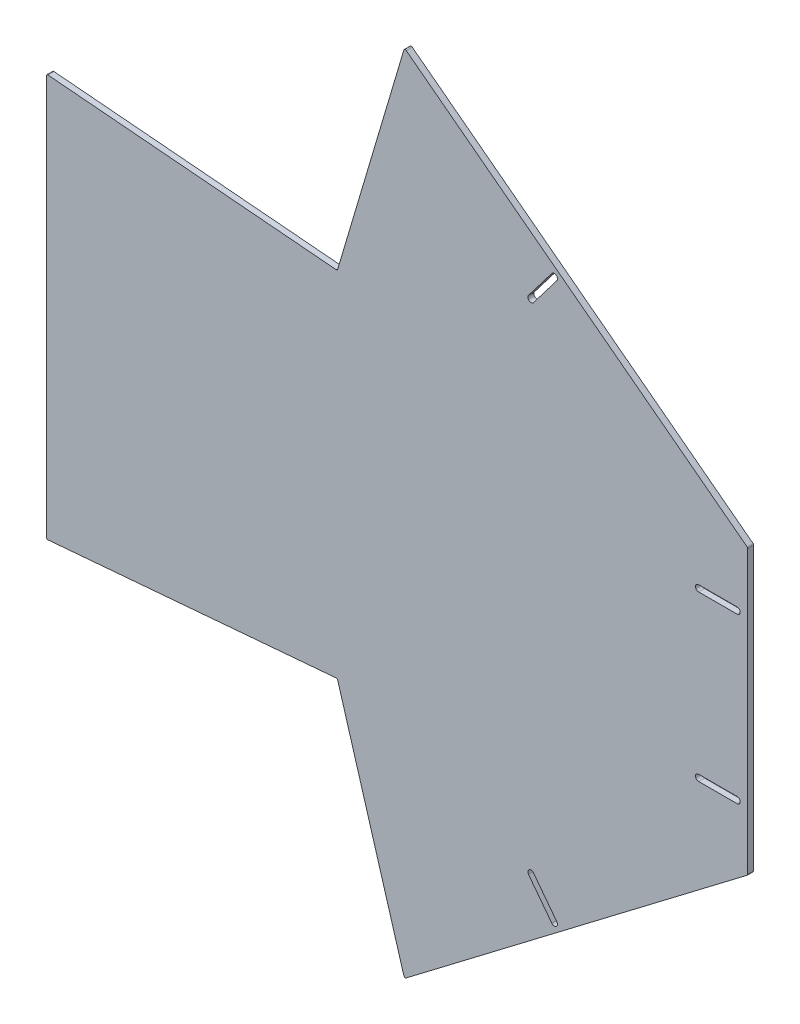
ISO-10303-21;
HEADER;
FILE_DESCRIPTION(('STEP AP214'),'2;1');
FILE_NAME('part.step','',(''),(''),'','','');
FILE_SCHEMA(('AUTOMOTIVE_DESIGN { 1 0 10303 214 1 1 1 1 }'));
ENDSEC;
DATA;
#1=APPLICATION_CONTEXT('core data for automotive mechanical design processes');
#2=APPLICATION_PROTOCOL_DEFINITION('international standard','automotive_design',2000,#1);
#3=PRODUCT_CONTEXT('',#1,'mechanical');
#4=PRODUCT('Part','Part','',(#3));
#5=PRODUCT_RELATED_PRODUCT_CATEGORY('part','',(#4));
#6=PRODUCT_DEFINITION_FORMATION('','',#4);
#7=PRODUCT_DEFINITION_CONTEXT('part definition',#1,'design');
#8=PRODUCT_DEFINITION('design','',#6,#7);
#9=PRODUCT_DEFINITION_SHAPE('','',#8);
#10=(LENGTH_UNIT() NAMED_UNIT(*) SI_UNIT(.MILLI.,.METRE.));
#11=(NAMED_UNIT(*) PLANE_ANGLE_UNIT() SI_UNIT($,.RADIAN.));
#12=(NAMED_UNIT(*) SI_UNIT($,.STERADIAN.) SOLID_ANGLE_UNIT());
#13=UNCERTAINTY_MEASURE_WITH_UNIT(LENGTH_MEASURE(1.E-05),#10,'distance_accuracy_value','');
#14=(GEOMETRIC_REPRESENTATION_CONTEXT(3) GLOBAL_UNCERTAINTY_ASSIGNED_CONTEXT((#13)) GLOBAL_UNIT_ASSIGNED_CONTEXT((#10,
#11,#12)) REPRESENTATION_CONTEXT('',''));
#15=CARTESIAN_POINT('',(0.,0.,0.));
#16=DIRECTION('',(0.,0.,1.));
#17=DIRECTION('',(1.,0.,0.));
#18=AXIS2_PLACEMENT_3D('',#15,#16,#17);
#19=CARTESIAN_POINT('',(-216.430442855931,164.6753369556,4.));
#20=DIRECTION('',(0.795828694120858,-0.605521832483264,0.));
#21=DIRECTION('',(0.605521832483264,0.795828694120858,0.));
#22=AXIS2_PLACEMENT_3D('',#19,#20,#21);
#23=PLANE('',#22);
#24=DIRECTION('',(-0.605521832483264,-0.795828694120858,0.));
#25=VECTOR('',#24,1.);
#26=CARTESIAN_POINT('',(-216.430442855931,164.6753369556,0.));
#27=LINE('',#26,#25);
#28=CARTESIAN_POINT('',(-127.898638669051,281.031422458357,0.));
#29=VERTEX_POINT('',#28);
#30=CARTESIAN_POINT('',(-143.521101947119,260.499042150039,0.));
#31=VERTEX_POINT('',#30);
#32=EDGE_CURVE('E472',#29,#31,#27,.T.);
#33=ORIENTED_EDGE('',*,*,#32,.T.);
#34=DIRECTION('',(0.,0.,-1.));
#35=VECTOR('',#34,1.);
#36=CARTESIAN_POINT('',(-143.521101947119,260.499042150039,4.));
#37=LINE('',#36,#35);
#38=CARTESIAN_POINT('',(-143.521101947119,260.499042150039,4.));
#39=VERTEX_POINT('',#38);
#40=EDGE_CURVE('E490',#39,#31,#37,.T.);
#41=ORIENTED_EDGE('',*,*,#40,.F.);
#42=DIRECTION('',(-0.605521832483264,-0.795828694120858,0.));
#43=VECTOR('',#42,1.);
#44=CARTESIAN_POINT('',(-216.430442855931,164.6753369556,4.));
#45=LINE('',#44,#43);
#46=CARTESIAN_POINT('',(-127.898638669051,281.031422458357,4.));
#47=VERTEX_POINT('',#46);
#48=EDGE_CURVE('E401',#47,#39,#45,.T.);
#49=ORIENTED_EDGE('',*,*,#48,.F.);
#50=DIRECTION('',(0.,0.,-1.));
#51=VECTOR('',#50,1.);
#52=CARTESIAN_POINT('',(-127.898638669051,281.031422458357,4.));
#53=LINE('',#52,#51);
#54=EDGE_CURVE('E482',#47,#29,#53,.T.);
#55=ORIENTED_EDGE('',*,*,#54,.T.);
#56=EDGE_LOOP('',(#33,#41,#49,#55));
#57=FACE_BOUND('',#56,.T.);
#58=ADVANCED_FACE('F46',(#57),#23,.F.);
#59=CARTESIAN_POINT('',(-145.192342204773,261.770637998254,4.));
#60=DIRECTION('',(0.,0.,-1.));
#61=DIRECTION('',(-1.,0.,0.));
#62=AXIS2_PLACEMENT_3D('',#59,#60,#61);
#63=CYLINDRICAL_SURFACE('',#62,2.10000000000001);
#64=CARTESIAN_POINT('',(-145.192342204773,261.770637998254,0.));
#65=DIRECTION('',(0.,0.,1.));
#66=DIRECTION('',(1.,0.,0.));
#67=AXIS2_PLACEMENT_3D('',#64,#65,#66);
#68=CIRCLE('',#67,2.10000000000001);
#69=CARTESIAN_POINT('',(-146.863582462426,263.042233846468,0.));
#70=VERTEX_POINT('',#69);
#71=EDGE_CURVE('E475',#31,#70,#68,.F.);
#72=ORIENTED_EDGE('',*,*,#71,.T.);
#73=DIRECTION('',(0.,0.,-1.));
#74=VECTOR('',#73,1.);
#75=CARTESIAN_POINT('',(-146.863582462426,263.042233846468,4.));
#76=LINE('',#75,#74);
#77=CARTESIAN_POINT('',(-146.863582462426,263.042233846468,4.));
#78=VERTEX_POINT('',#77);
#79=EDGE_CURVE('E488',#78,#70,#76,.T.);
#80=ORIENTED_EDGE('',*,*,#79,.F.);
#81=CARTESIAN_POINT('',(-145.192342204773,261.770637998254,4.));
#82=DIRECTION('',(0.,0.,1.));
#83=DIRECTION('',(1.,0.,0.));
#84=AXIS2_PLACEMENT_3D('',#81,#82,#83);
#85=CIRCLE('',#84,2.10000000000001);
#86=EDGE_CURVE('E406',#39,#78,#85,.F.);
#87=ORIENTED_EDGE('',*,*,#86,.F.);
#88=ORIENTED_EDGE('',*,*,#40,.T.);
#89=EDGE_LOOP('',(#72,#80,#87,#88));
#90=FACE_BOUND('',#89,.T.);
#91=ADVANCED_FACE('F640',(#90),#63,.F.);
#92=CARTESIAN_POINT('',(-219.772923371239,167.21852865203,4.));
#93=DIRECTION('',(0.795828694120859,-0.605521832483263,0.));
#94=DIRECTION('',(0.605521832483263,0.795828694120859,0.));
#95=AXIS2_PLACEMENT_3D('',#92,#93,#94);
#96=PLANE('',#95);
#97=DIRECTION('',(-0.605521832483263,-0.795828694120859,0.));
#98=VECTOR('',#97,1.);
#99=CARTESIAN_POINT('',(-219.772923371239,167.21852865203,0.));
#100=LINE('',#99,#98);
#101=CARTESIAN_POINT('',(-131.241119184358,283.574614154786,0.));
#102=VERTEX_POINT('',#101);
#103=EDGE_CURVE('E478',#102,#70,#100,.T.);
#104=ORIENTED_EDGE('',*,*,#103,.F.);
#105=DIRECTION('',(0.,0.,-1.));
#106=VECTOR('',#105,1.);
#107=CARTESIAN_POINT('',(-131.241119184358,283.574614154786,4.));
#108=LINE('',#107,#106);
#109=CARTESIAN_POINT('',(-131.241119184358,283.574614154786,4.));
#110=VERTEX_POINT('',#109);
#111=EDGE_CURVE('E485',#110,#102,#108,.T.);
#112=ORIENTED_EDGE('',*,*,#111,.F.);
#113=DIRECTION('',(-0.605521832483263,-0.795828694120859,0.));
#114=VECTOR('',#113,1.);
#115=CARTESIAN_POINT('',(-219.772923371239,167.21852865203,4.));
#116=LINE('',#115,#114);
#117=EDGE_CURVE('E408',#110,#78,#116,.T.);
#118=ORIENTED_EDGE('',*,*,#117,.T.);
#119=ORIENTED_EDGE('',*,*,#79,.T.);
#120=EDGE_LOOP('',(#104,#112,#118,#119));
#121=FACE_BOUND('',#120,.T.);
#122=ADVANCED_FACE('F646',(#121),#96,.T.);
#123=CARTESIAN_POINT('',(0.,152.1,4.));
#124=DIRECTION('',(0.,1.,0.));
#125=DIRECTION('',(0.,0.,1.));
#126=AXIS2_PLACEMENT_3D('',#123,#124,#125);
#127=PLANE('',#126);
#128=DIRECTION('',(1.,0.,0.));
#129=VECTOR('',#128,1.);
#130=CARTESIAN_POINT('',(0.,152.1,0.));
#131=LINE('',#130,#129);
#132=CARTESIAN_POINT('',(-32.9,152.1,0.));
#133=VERTEX_POINT('',#132);
#134=CARTESIAN_POINT('',(-7.09999999999999,152.1,0.));
#135=VERTEX_POINT('',#134);
#136=EDGE_CURVE('E461',#133,#135,#131,.T.);
#137=ORIENTED_EDGE('',*,*,#136,.T.);
#138=DIRECTION('',(0.,0.,-1.));
#139=VECTOR('',#138,1.);
#140=CARTESIAN_POINT('',(-7.09999999999999,152.1,4.));
#141=LINE('',#140,#139);
#142=CARTESIAN_POINT('',(-7.09999999999999,152.1,4.));
#143=VERTEX_POINT('',#142);
#144=EDGE_CURVE('E486',#143,#135,#141,.T.);
#145=ORIENTED_EDGE('',*,*,#144,.F.);
#146=DIRECTION('',(1.,0.,0.));
#147=VECTOR('',#146,1.);
#148=CARTESIAN_POINT('',(0.,152.1,4.));
#149=LINE('',#148,#147);
#150=CARTESIAN_POINT('',(-32.9,152.1,4.));
#151=VERTEX_POINT('',#150);
#152=EDGE_CURVE('E385',#151,#143,#149,.T.);
#153=ORIENTED_EDGE('',*,*,#152,.F.);
#154=DIRECTION('',(0.,0.,-1.));
#155=VECTOR('',#154,1.);
#156=CARTESIAN_POINT('',(-32.9,152.1,4.));
#157=LINE('',#156,#155);
#158=EDGE_CURVE('E494',#151,#133,#157,.T.);
#159=ORIENTED_EDGE('',*,*,#158,.T.);
#160=EDGE_LOOP('',(#137,#145,#153,#159));
#161=FACE_BOUND('',#160,.T.);
#162=ADVANCED_FACE('F665',(#161),#127,.F.);
#163=CARTESIAN_POINT('',(-7.09999999999999,150.,4.));
#164=DIRECTION('',(0.,0.,-1.));
#165=DIRECTION('',(-1.,0.,0.));
#166=AXIS2_PLACEMENT_3D('',#163,#164,#165);
#167=CYLINDRICAL_SURFACE('',#166,2.1);
#168=CARTESIAN_POINT('',(-7.09999999999999,150.,0.));
#169=DIRECTION('',(0.,0.,1.));
#170=DIRECTION('',(1.,0.,0.));
#171=AXIS2_PLACEMENT_3D('',#168,#169,#170);
#172=CIRCLE('',#171,2.1);
#173=CARTESIAN_POINT('',(-7.09999999999999,147.9,0.));
#174=VERTEX_POINT('',#173);
#175=EDGE_CURVE('E464',#135,#174,#172,.F.);
#176=ORIENTED_EDGE('',*,*,#175,.T.);
#177=DIRECTION('',(0.,0.,-1.));
#178=VECTOR('',#177,1.);
#179=CARTESIAN_POINT('',(-7.09999999999999,147.9,4.));
#180=LINE('',#179,#178);
#181=CARTESIAN_POINT('',(-7.09999999999999,147.9,4.));
#182=VERTEX_POINT('',#181);
#183=EDGE_CURVE('E500',#182,#174,#180,.T.);
#184=ORIENTED_EDGE('',*,*,#183,.F.);
#185=CARTESIAN_POINT('',(-7.09999999999999,150.,4.));
#186=DIRECTION('',(0.,0.,1.));
#187=DIRECTION('',(1.,0.,0.));
#188=AXIS2_PLACEMENT_3D('',#185,#186,#187);
#189=CIRCLE('',#188,2.1);
#190=EDGE_CURVE('E390',#143,#182,#189,.F.);
#191=ORIENTED_EDGE('',*,*,#190,.F.);
#192=ORIENTED_EDGE('',*,*,#144,.T.);
#193=EDGE_LOOP('',(#176,#184,#191,#192));
#194=FACE_BOUND('',#193,.T.);
#195=ADVANCED_FACE('F661',(#194),#167,.F.);
#196=CARTESIAN_POINT('',(0.,147.9,4.));
#197=DIRECTION('',(0.,1.,0.));
#198=DIRECTION('',(0.,0.,1.));
#199=AXIS2_PLACEMENT_3D('',#196,#197,#198);
#200=PLANE('',#199);
#201=DIRECTION('',(1.,0.,0.));
#202=VECTOR('',#201,1.);
#203=CARTESIAN_POINT('',(0.,147.9,0.));
#204=LINE('',#203,#202);
#205=CARTESIAN_POINT('',(-32.9,147.9,0.));
#206=VERTEX_POINT('',#205);
#207=EDGE_CURVE('E467',#206,#174,#204,.T.);
#208=ORIENTED_EDGE('',*,*,#207,.F.);
#209=DIRECTION('',(0.,0.,-1.));
#210=VECTOR('',#209,1.);
#211=CARTESIAN_POINT('',(-32.9,147.9,4.));
#212=LINE('',#211,#210);
#213=CARTESIAN_POINT('',(-32.9,147.9,4.));
#214=VERTEX_POINT('',#213);
#215=EDGE_CURVE('E497',#214,#206,#212,.T.);
#216=ORIENTED_EDGE('',*,*,#215,.F.);
#217=DIRECTION('',(1.,0.,0.));
#218=VECTOR('',#217,1.);
#219=CARTESIAN_POINT('',(0.,147.9,4.));
#220=LINE('',#219,#218);
#221=EDGE_CURVE('E394',#214,#182,#220,.T.);
#222=ORIENTED_EDGE('',*,*,#221,.T.);
#223=ORIENTED_EDGE('',*,*,#183,.T.);
#224=EDGE_LOOP('',(#208,#216,#222,#223));
#225=FACE_BOUND('',#224,.T.);
#226=ADVANCED_FACE('F657',(#225),#200,.T.);
#227=CARTESIAN_POINT('',(-7.1,40.,4.));
#228=DIRECTION('',(0.,0.,-1.));
#229=DIRECTION('',(-1.,0.,0.));
#230=AXIS2_PLACEMENT_3D('',#227,#228,#229);
#231=CYLINDRICAL_SURFACE('',#230,2.1);
#232=CARTESIAN_POINT('',(-7.1,40.,0.));
#233=DIRECTION('',(0.,0.,1.));
#234=DIRECTION('',(1.,0.,0.));
#235=AXIS2_PLACEMENT_3D('',#232,#233,#234);
#236=CIRCLE('',#235,2.1);
#237=CARTESIAN_POINT('',(-7.1,37.9,0.));
#238=VERTEX_POINT('',#237);
#239=CARTESIAN_POINT('',(-7.1,42.1,0.));
#240=VERTEX_POINT('',#239);
#241=EDGE_CURVE('E449',#238,#240,#236,.T.);
#242=ORIENTED_EDGE('',*,*,#241,.F.);
#243=DIRECTION('',(0.,0.,-1.));
#244=VECTOR('',#243,1.);
#245=CARTESIAN_POINT('',(-7.1,37.9,4.));
#246=LINE('',#245,#244);
#247=CARTESIAN_POINT('',(-7.1,37.9,4.));
#248=VERTEX_POINT('',#247);
#249=EDGE_CURVE('E498',#248,#238,#246,.T.);
#250=ORIENTED_EDGE('',*,*,#249,.F.);
#251=CARTESIAN_POINT('',(-7.1,40.,4.));
#252=DIRECTION('',(0.,0.,1.));
#253=DIRECTION('',(1.,0.,0.));
#254=AXIS2_PLACEMENT_3D('',#251,#252,#253);
#255=CIRCLE('',#254,2.1);
#256=CARTESIAN_POINT('',(-7.1,42.1,4.));
#257=VERTEX_POINT('',#256);
#258=EDGE_CURVE('E364',#248,#257,#255,.T.);
#259=ORIENTED_EDGE('',*,*,#258,.T.);
#260=DIRECTION('',(0.,0.,-1.));
#261=VECTOR('',#260,1.);
#262=CARTESIAN_POINT('',(-7.1,42.1,4.));
#263=LINE('',#262,#261);
#264=EDGE_CURVE('E266',#257,#240,#263,.T.);
#265=ORIENTED_EDGE('',*,*,#264,.T.);
#266=EDGE_LOOP('',(#242,#250,#259,#265));
#267=FACE_BOUND('',#266,.T.);
#268=ADVANCED_FACE('F660',(#267),#231,.F.);
#269=CARTESIAN_POINT('',(0.,37.9,4.));
#270=DIRECTION('',(0.,1.,0.));
#271=DIRECTION('',(0.,0.,1.));
#272=AXIS2_PLACEMENT_3D('',#269,#270,#271);
#273=PLANE('',#272);
#274=DIRECTION('',(1.,0.,0.));
#275=VECTOR('',#274,1.);
#276=CARTESIAN_POINT('',(0.,37.9,0.));
#277=LINE('',#276,#275);
#278=CARTESIAN_POINT('',(-32.9,37.9,0.));
#279=VERTEX_POINT('',#278);
#280=EDGE_CURVE('E452',#279,#238,#277,.T.);
#281=ORIENTED_EDGE('',*,*,#280,.F.);
#282=DIRECTION('',(0.,0.,-1.));
#283=VECTOR('',#282,1.);
#284=CARTESIAN_POINT('',(-32.9,37.9,4.));
#285=LINE('',#284,#283);
#286=CARTESIAN_POINT('',(-32.9,37.9,4.));
#287=VERTEX_POINT('',#286);
#288=EDGE_CURVE('E507',#287,#279,#285,.T.);
#289=ORIENTED_EDGE('',*,*,#288,.F.);
#290=DIRECTION('',(1.,0.,0.));
#291=VECTOR('',#290,1.);
#292=CARTESIAN_POINT('',(0.,37.9,4.));
#293=LINE('',#292,#291);
#294=EDGE_CURVE('E369',#287,#248,#293,.T.);
#295=ORIENTED_EDGE('',*,*,#294,.T.);
#296=ORIENTED_EDGE('',*,*,#249,.T.);
#297=EDGE_LOOP('',(#281,#289,#295,#296));
#298=FACE_BOUND('',#297,.T.);
#299=ADVANCED_FACE('F678',(#298),#273,.T.);
#300=CARTESIAN_POINT('',(-32.9,40.,4.));
#301=DIRECTION('',(0.,0.,-1.));
#302=DIRECTION('',(-1.,0.,0.));
#303=AXIS2_PLACEMENT_3D('',#300,#301,#302);
#304=CYLINDRICAL_SURFACE('',#303,2.1);
#305=CARTESIAN_POINT('',(-32.9,40.,0.));
#306=DIRECTION('',(0.,0.,1.));
#307=DIRECTION('',(1.,0.,0.));
#308=AXIS2_PLACEMENT_3D('',#305,#306,#307);
#309=CIRCLE('',#308,2.1);
#310=CARTESIAN_POINT('',(-32.9,42.1,0.));
#311=VERTEX_POINT('',#310);
#312=EDGE_CURVE('E455',#311,#279,#309,.T.);
#313=ORIENTED_EDGE('',*,*,#312,.F.);
#314=DIRECTION('',(0.,0.,-1.));
#315=VECTOR('',#314,1.);
#316=CARTESIAN_POINT('',(-32.9,42.1,4.));
#317=LINE('',#316,#315);
#318=CARTESIAN_POINT('',(-32.9,42.1,4.));
#319=VERTEX_POINT('',#318);
#320=EDGE_CURVE('E505',#319,#311,#317,.T.);
#321=ORIENTED_EDGE('',*,*,#320,.F.);
#322=CARTESIAN_POINT('',(-32.9,40.,4.));
#323=DIRECTION('',(0.,0.,1.));
#324=DIRECTION('',(1.,0.,0.));
#325=AXIS2_PLACEMENT_3D('',#322,#323,#324);
#326=CIRCLE('',#325,2.1);
#327=EDGE_CURVE('E377',#319,#287,#326,.T.);
#328=ORIENTED_EDGE('',*,*,#327,.T.);
#329=ORIENTED_EDGE('',*,*,#288,.T.);
#330=EDGE_LOOP('',(#313,#321,#328,#329));
#331=FACE_BOUND('',#330,.T.);
#332=ADVANCED_FACE('F674',(#331),#304,.F.);
#333=CARTESIAN_POINT('',(-259.115357669466,-76.9163482766205,4.));
#334=DIRECTION('',(-0.958655469434118,-0.284569307768865,0.));
#335=DIRECTION('',(0.284569307768865,-0.958655469434118,0.));
#336=AXIS2_PLACEMENT_3D('',#333,#334,#335);
#337=PLANE('',#336);
#338=DIRECTION('',(-0.284569307768865,0.958655469434118,0.));
#339=VECTOR('',#338,1.);
#340=CARTESIAN_POINT('',(-259.115357669466,-76.9163482766205,4.));
#341=LINE('',#340,#339);
#342=CARTESIAN_POINT('',(-230.411993405445,-173.612078953289,4.));
#343=VERTEX_POINT('',#342);
#344=CARTESIAN_POINT('',(-274.768194434869,-24.1851605917524,4.));
#345=VERTEX_POINT('',#344);
#346=EDGE_CURVE('E301',#343,#345,#341,.T.);
#347=ORIENTED_EDGE('',*,*,#346,.T.);
#348=DIRECTION('',(0.,0.,-1.));
#349=VECTOR('',#348,1.);
#350=CARTESIAN_POINT('',(-274.768194434869,-24.1851605917524,4.));
#351=LINE('',#350,#349);
#352=CARTESIAN_POINT('',(-274.768194434869,-24.1851605917524,0.));
#353=VERTEX_POINT('',#352);
#354=EDGE_CURVE('E515',#345,#353,#351,.T.);
#355=ORIENTED_EDGE('',*,*,#354,.T.);
#356=DIRECTION('',(-0.284569307768865,0.958655469434118,0.));
#357=VECTOR('',#356,1.);
#358=CARTESIAN_POINT('',(-259.115357669466,-76.9163482766205,0.));
#359=LINE('',#358,#357);
#360=CARTESIAN_POINT('',(-230.411993405445,-173.612078953289,0.));
#361=VERTEX_POINT('',#360);
#362=EDGE_CURVE('E426',#361,#353,#359,.T.);
#363=ORIENTED_EDGE('',*,*,#362,.F.);
#364=DIRECTION('',(0.,0.,-1.));
#365=VECTOR('',#364,1.);
#366=CARTESIAN_POINT('',(-230.411993405445,-173.612078953289,4.));
#367=LINE('',#366,#365);
#368=EDGE_CURVE('E493',#361,#343,#367,.F.);
#369=ORIENTED_EDGE('',*,*,#368,.T.);
#370=EDGE_LOOP('',(#347,#355,#363,#369));
#371=FACE_BOUND('',#370,.T.);
#372=ADVANCED_FACE('F677',(#371),#337,.T.);
#373=CARTESIAN_POINT('',(0.,0.,4.));
#374=DIRECTION('',(-0.605521832483263,0.795828694120859,0.));
#375=DIRECTION('',(-0.795828694120859,-0.605521832483263,0.));
#376=AXIS2_PLACEMENT_3D('',#373,#374,#375);
#377=PLANE('',#376);
#378=DIRECTION('',(0.795828694120859,0.605521832483262,0.));
#379=VECTOR('',#378,1.);
#380=CARTESIAN_POINT('',(0.,0.,0.));
#381=LINE('',#380,#379);
#382=CARTESIAN_POINT('',(-228.847816103528,-174.123338339641,0.));
#383=VERTEX_POINT('',#382);
#384=CARTESIAN_POINT('',(-0.394478167516737,-0.300146431806213,0.));
#385=VERTEX_POINT('',#384);
#386=EDGE_CURVE('E429',#383,#385,#381,.T.);
#387=ORIENTED_EDGE('',*,*,#386,.T.);
#388=DIRECTION('',(0.,0.,-1.));
#389=VECTOR('',#388,1.);
#390=CARTESIAN_POINT('',(-0.394478167516737,-0.300146431806213,4.));
#391=LINE('',#390,#389);
#392=CARTESIAN_POINT('',(-0.394478167516737,-0.300146431806213,4.));
#393=VERTEX_POINT('',#392);
#394=EDGE_CURVE('E557',#385,#393,#391,.F.);
#395=ORIENTED_EDGE('',*,*,#394,.T.);
#396=DIRECTION('',(0.795828694120859,0.605521832483262,0.));
#397=VECTOR('',#396,1.);
#398=CARTESIAN_POINT('',(0.,0.,4.));
#399=LINE('',#398,#397);
#400=CARTESIAN_POINT('',(-228.847816103528,-174.123338339641,4.));
#401=VERTEX_POINT('',#400);
#402=EDGE_CURVE('E306',#401,#393,#399,.T.);
#403=ORIENTED_EDGE('',*,*,#402,.F.);
#404=DIRECTION('',(0.,0.,-1.));
#405=VECTOR('',#404,1.);
#406=CARTESIAN_POINT('',(-228.847816103528,-174.123338339641,0.));
#407=LINE('',#406,#405);
#408=EDGE_CURVE('E561',#401,#383,#407,.T.);
#409=ORIENTED_EDGE('',*,*,#408,.T.);
#410=EDGE_LOOP('',(#387,#395,#403,#409));
#411=FACE_BOUND('',#410,.T.);
#412=ADVANCED_FACE('F600',(#411),#377,.F.);
#413=CARTESIAN_POINT('',(0.,0.,4.));
#414=DIRECTION('',(-1.,0.,0.));
#415=DIRECTION('',(0.,0.,1.));
#416=AXIS2_PLACEMENT_3D('',#413,#414,#415);
#417=PLANE('',#416);
#418=DIRECTION('',(0.,1.,0.));
#419=VECTOR('',#418,1.);
#420=CARTESIAN_POINT('',(0.,0.,0.));
#421=LINE('',#420,#419);
#422=CARTESIAN_POINT('',(0.,0.495682262314646,0.));
#423=VERTEX_POINT('',#422);
#424=CARTESIAN_POINT('',(0.,189.504317737685,0.));
#425=VERTEX_POINT('',#424);
#426=EDGE_CURVE('E432',#423,#425,#421,.T.);
#427=ORIENTED_EDGE('',*,*,#426,.T.);
#428=DIRECTION('',(0.,0.,-1.));
#429=VECTOR('',#428,1.);
#430=CARTESIAN_POINT('',(0.,189.504317737685,4.));
#431=LINE('',#430,#429);
#432=CARTESIAN_POINT('',(0.,189.504317737685,4.));
#433=VERTEX_POINT('',#432);
#434=EDGE_CURVE('E594',#425,#433,#431,.F.);
#435=ORIENTED_EDGE('',*,*,#434,.T.);
#436=DIRECTION('',(0.,1.,0.));
#437=VECTOR('',#436,1.);
#438=CARTESIAN_POINT('',(0.,0.,4.));
#439=LINE('',#438,#437);
#440=CARTESIAN_POINT('',(0.,0.495682262314646,4.));
#441=VERTEX_POINT('',#440);
#442=EDGE_CURVE('E334',#441,#433,#439,.T.);
#443=ORIENTED_EDGE('',*,*,#442,.F.);
#444=DIRECTION('',(0.,0.,-1.));
#445=VECTOR('',#444,1.);
#446=CARTESIAN_POINT('',(0.,0.495682262314646,4.));
#447=LINE('',#446,#445);
#448=EDGE_CURVE('E591',#441,#423,#447,.T.);
#449=ORIENTED_EDGE('',*,*,#448,.T.);
#450=EDGE_LOOP('',(#427,#435,#443,#449));
#451=FACE_BOUND('',#450,.T.);
#452=ADVANCED_FACE('F613',(#451),#417,.F.);
#453=CARTESIAN_POINT('',(91.5594133492966,120.335228973361,4.));
#454=DIRECTION('',(0.605521832483262,0.795828694120859,0.));
#455=DIRECTION('',(-0.795828694120859,0.605521832483262,0.));
#456=AXIS2_PLACEMENT_3D('',#453,#454,#455);
#457=PLANE('',#456);
#458=DIRECTION('',(0.795828694120859,-0.605521832483262,0.));
#459=VECTOR('',#458,1.);
#460=CARTESIAN_POINT('',(91.5594133492966,120.335228973361,4.));
#461=LINE('',#460,#459);
#462=CARTESIAN_POINT('',(-228.847816103528,364.12333833964,4.));
#463=VERTEX_POINT('',#462);
#464=CARTESIAN_POINT('',(-0.394478167516782,190.300146431806,4.));
#465=VERTEX_POINT('',#464);
#466=EDGE_CURVE('E339',#463,#465,#461,.T.);
#467=ORIENTED_EDGE('',*,*,#466,.T.);
#468=DIRECTION('',(0.,0.,-1.));
#469=VECTOR('',#468,1.);
#470=CARTESIAN_POINT('',(-0.394478167516738,190.300146431806,0.));
#471=LINE('',#470,#469);
#472=CARTESIAN_POINT('',(-0.394478167516782,190.300146431806,0.));
#473=VERTEX_POINT('',#472);
#474=EDGE_CURVE('E588',#465,#473,#471,.T.);
#475=ORIENTED_EDGE('',*,*,#474,.T.);
#476=DIRECTION('',(0.795828694120859,-0.605521832483262,0.));
#477=VECTOR('',#476,1.);
#478=CARTESIAN_POINT('',(91.5594133492966,120.335228973361,0.));
#479=LINE('',#478,#477);
#480=CARTESIAN_POINT('',(-228.847816103528,364.12333833964,0.));
#481=VERTEX_POINT('',#480);
#482=EDGE_CURVE('E435',#481,#473,#479,.T.);
#483=ORIENTED_EDGE('',*,*,#482,.F.);
#484=DIRECTION('',(0.,0.,-1.));
#485=VECTOR('',#484,1.);
#486=CARTESIAN_POINT('',(-228.847816103528,364.12333833964,4.));
#487=LINE('',#486,#485);
#488=EDGE_CURVE('E580',#481,#463,#487,.F.);
#489=ORIENTED_EDGE('',*,*,#488,.T.);
#490=EDGE_LOOP('',(#467,#475,#483,#489));
#491=FACE_BOUND('',#490,.T.);
#492=ADVANCED_FACE('F637',(#491),#457,.T.);
#493=CARTESIAN_POINT('',(-310.94810310135,92.3024895521902,4.));
#494=DIRECTION('',(0.958655469434118,-0.284569307768865,0.));
#495=DIRECTION('',(0.284569307768865,0.958655469434118,0.));
#496=AXIS2_PLACEMENT_3D('',#493,#494,#495);
#497=PLANE('',#496);
#498=DIRECTION('',(-0.284569307768865,-0.958655469434118,0.));
#499=VECTOR('',#498,1.);
#500=CARTESIAN_POINT('',(-310.94810310135,92.3024895521902,0.));
#501=LINE('',#500,#499);
#502=CARTESIAN_POINT('',(-230.411993405445,363.612078953289,0.));
#503=VERTEX_POINT('',#502);
#504=CARTESIAN_POINT('',(-274.768194434869,214.185160591752,0.));
#505=VERTEX_POINT('',#504);
#506=EDGE_CURVE('E438',#503,#505,#501,.T.);
#507=ORIENTED_EDGE('',*,*,#506,.T.);
#508=DIRECTION('',(0.,0.,-1.));
#509=VECTOR('',#508,1.);
#510=CARTESIAN_POINT('',(-274.768194434869,214.185160591752,4.));
#511=LINE('',#510,#509);
#512=CARTESIAN_POINT('',(-274.768194434869,214.185160591752,4.));
#513=VERTEX_POINT('',#512);
#514=EDGE_CURVE('E556',#505,#513,#511,.F.);
#515=ORIENTED_EDGE('',*,*,#514,.T.);
#516=DIRECTION('',(-0.284569307768865,-0.958655469434118,0.));
#517=VECTOR('',#516,1.);
#518=CARTESIAN_POINT('',(-310.94810310135,92.3024895521902,4.));
#519=LINE('',#518,#517);
#520=CARTESIAN_POINT('',(-230.411993405445,363.612078953289,4.));
#521=VERTEX_POINT('',#520);
#522=EDGE_CURVE('E344',#521,#513,#519,.T.);
#523=ORIENTED_EDGE('',*,*,#522,.F.);
#524=DIRECTION('',(0.,0.,-1.));
#525=VECTOR('',#524,1.);
#526=CARTESIAN_POINT('',(-230.411993405445,363.612078953288,0.));
#527=LINE('',#526,#525);
#528=EDGE_CURVE('E553',#521,#503,#527,.T.);
#529=ORIENTED_EDGE('',*,*,#528,.T.);
#530=EDGE_LOOP('',(#507,#515,#523,#529));
#531=FACE_BOUND('',#530,.T.);
#532=ADVANCED_FACE('F552',(#531),#497,.F.);
#533=CARTESIAN_POINT('',(16.0539325842697,188.633707865169,4.));
#534=DIRECTION('',(-0.0847998304005088,-0.996398007205978,0.));
#535=DIRECTION('',(0.996398007205978,-0.0847998304005088,0.));
#536=AXIS2_PLACEMENT_3D('',#533,#534,#535);
#537=PLANE('',#536);
#538=DIRECTION('',(-0.996398007205978,0.0847998304005088,0.));
#539=VECTOR('',#538,1.);
#540=CARTESIAN_POINT('',(16.0539325842697,188.633707865169,0.));
#541=LINE('',#540,#539);
#542=CARTESIAN_POINT('',(-275.811649734704,213.473331892315,0.));
#543=VERTEX_POINT('',#542);
#544=CARTESIAN_POINT('',(-468.915200169599,229.907676610179,0.));
#545=VERTEX_POINT('',#544);
#546=EDGE_CURVE('E441',#543,#545,#541,.T.);
#547=ORIENTED_EDGE('',*,*,#546,.T.);
#548=DIRECTION('',(0.,0.,-1.));
#549=VECTOR('',#548,1.);
#550=CARTESIAN_POINT('',(-468.915200169599,229.907676610179,4.));
#551=LINE('',#550,#549);
#552=CARTESIAN_POINT('',(-468.915200169599,229.907676610179,4.));
#553=VERTEX_POINT('',#552);
#554=EDGE_CURVE('E62',#545,#553,#551,.F.);
#555=ORIENTED_EDGE('',*,*,#554,.T.);
#556=DIRECTION('',(-0.996398007205978,0.0847998304005088,0.));
#557=VECTOR('',#556,1.);
#558=CARTESIAN_POINT('',(16.0539325842697,188.633707865169,4.));
#559=LINE('',#558,#557);
#560=CARTESIAN_POINT('',(-275.811649734704,213.473331892315,4.));
#561=VERTEX_POINT('',#560);
#562=EDGE_CURVE('E352',#561,#553,#559,.T.);
#563=ORIENTED_EDGE('',*,*,#562,.F.);
#564=DIRECTION('',(0.,0.,-1.));
#565=VECTOR('',#564,1.);
#566=CARTESIAN_POINT('',(-275.811649734704,213.473331892315,0.));
#567=LINE('',#566,#565);
#568=EDGE_CURVE('E577',#561,#543,#567,.T.);
#569=ORIENTED_EDGE('',*,*,#568,.T.);
#570=EDGE_LOOP('',(#547,#555,#563,#569));
#571=FACE_BOUND('',#570,.T.);
#572=ADVANCED_FACE('F629',(#571),#537,.F.);
#573=CARTESIAN_POINT('',(-470.,0.,4.));
#574=DIRECTION('',(1.,0.,0.));
#575=DIRECTION('',(0.,0.,-1.));
#576=AXIS2_PLACEMENT_3D('',#573,#574,#575);
#577=PLANE('',#576);
#578=DIRECTION('',(0.,-1.,0.));
#579=VECTOR('',#578,1.);
#580=CARTESIAN_POINT('',(-470.,0.,0.));
#581=LINE('',#580,#579);
#582=CARTESIAN_POINT('',(-470.,228.911278602973,0.));
#583=VERTEX_POINT('',#582);
#584=CARTESIAN_POINT('',(-470.,-38.9112786029727,0.));
#585=VERTEX_POINT('',#584);
#586=EDGE_CURVE('E443',#583,#585,#581,.T.);
#587=ORIENTED_EDGE('',*,*,#586,.T.);
#588=DIRECTION('',(0.,0.,-1.));
#589=VECTOR('',#588,1.);
#590=CARTESIAN_POINT('',(-470.,-38.9112786029727,4.));
#591=LINE('',#590,#589);
#592=CARTESIAN_POINT('',(-470.,-38.9112786029727,4.));
#593=VERTEX_POINT('',#592);
#594=EDGE_CURVE('E537',#585,#593,#591,.F.);
#595=ORIENTED_EDGE('',*,*,#594,.T.);
#596=DIRECTION('',(0.,-1.,0.));
#597=VECTOR('',#596,1.);
#598=CARTESIAN_POINT('',(-470.,0.,4.));
#599=LINE('',#598,#597);
#600=CARTESIAN_POINT('',(-470.,228.911278602973,4.));
#601=VERTEX_POINT('',#600);
#602=EDGE_CURVE('E355',#601,#593,#599,.T.);
#603=ORIENTED_EDGE('',*,*,#602,.F.);
#604=DIRECTION('',(0.,0.,-1.));
#605=VECTOR('',#604,1.);
#606=CARTESIAN_POINT('',(-470.,228.911278602973,4.));
#607=LINE('',#606,#605);
#608=EDGE_CURVE('E535',#601,#583,#607,.T.);
#609=ORIENTED_EDGE('',*,*,#608,.T.);
#610=EDGE_LOOP('',(#587,#595,#603,#609));
#611=FACE_BOUND('',#610,.T.);
#612=ADVANCED_FACE('F626',(#611),#577,.F.);
#613=CARTESIAN_POINT('',(-145.192342204773,-71.7706379982535,4.));
#614=DIRECTION('',(0.,0.,-1.));
#615=DIRECTION('',(-1.,0.,0.));
#616=AXIS2_PLACEMENT_3D('',#613,#614,#615);
#617=CYLINDRICAL_SURFACE('',#616,2.10000000000002);
#618=CARTESIAN_POINT('',(-145.192342204773,-71.7706379982535,0.));
#619=DIRECTION('',(0.,0.,1.));
#620=DIRECTION('',(1.,0.,0.));
#621=AXIS2_PLACEMENT_3D('',#618,#619,#620);
#622=CIRCLE('',#621,2.10000000000002);
#623=CARTESIAN_POINT('',(-143.521101947119,-70.4990421500386,0.));
#624=VERTEX_POINT('',#623);
#625=CARTESIAN_POINT('',(-146.863582462427,-73.0422338464683,0.));
#626=VERTEX_POINT('',#625);
#627=EDGE_CURVE('E261',#624,#626,#622,.T.);
#628=ORIENTED_EDGE('',*,*,#627,.F.);
#629=DIRECTION('',(0.,0.,-1.));
#630=VECTOR('',#629,1.);
#631=CARTESIAN_POINT('',(-143.521101947119,-70.4990421500386,4.));
#632=LINE('',#631,#630);
#633=CARTESIAN_POINT('',(-143.521101947119,-70.4990421500386,4.));
#634=VERTEX_POINT('',#633);
#635=EDGE_CURVE('E256',#634,#624,#632,.T.);
#636=ORIENTED_EDGE('',*,*,#635,.F.);
#637=CARTESIAN_POINT('',(-145.192342204773,-71.7706379982535,4.));
#638=DIRECTION('',(0.,0.,1.));
#639=DIRECTION('',(1.,0.,0.));
#640=AXIS2_PLACEMENT_3D('',#637,#638,#639);
#641=CIRCLE('',#640,2.10000000000002);
#642=CARTESIAN_POINT('',(-146.863582462427,-73.0422338464683,4.));
#643=VERTEX_POINT('',#642);
#644=EDGE_CURVE('E259',#634,#643,#641,.T.);
#645=ORIENTED_EDGE('',*,*,#644,.T.);
#646=DIRECTION('',(0.,0.,-1.));
#647=VECTOR('',#646,1.);
#648=CARTESIAN_POINT('',(-146.863582462427,-73.0422338464683,4.));
#649=LINE('',#648,#647);
#650=EDGE_CURVE('E416',#643,#626,#649,.T.);
#651=ORIENTED_EDGE('',*,*,#650,.T.);
#652=EDGE_LOOP('',(#628,#636,#645,#651));
#653=FACE_BOUND('',#652,.T.);
#654=ADVANCED_FACE('F258',(#653),#617,.F.);
#655=CARTESIAN_POINT('',(-124.871029506634,-95.0105659289611,4.));
#656=DIRECTION('',(-0.795828694120859,-0.605521832483263,0.));
#657=DIRECTION('',(0.605521832483263,-0.795828694120859,0.));
#658=AXIS2_PLACEMENT_3D('',#655,#656,#657);
#659=PLANE('',#658);
#660=DIRECTION('',(-0.605521832483263,0.795828694120859,0.));
#661=VECTOR('',#660,1.);
#662=CARTESIAN_POINT('',(-124.871029506634,-95.0105659289611,0.));
#663=LINE('',#662,#661);
#664=CARTESIAN_POINT('',(-127.898638669051,-91.0314224583568,0.));
#665=VERTEX_POINT('',#664);
#666=EDGE_CURVE('E418',#665,#624,#663,.T.);
#667=ORIENTED_EDGE('',*,*,#666,.F.);
#668=DIRECTION('',(0.,0.,-1.));
#669=VECTOR('',#668,1.);
#670=CARTESIAN_POINT('',(-127.898638669051,-91.0314224583568,4.));
#671=LINE('',#670,#669);
#672=CARTESIAN_POINT('',(-127.898638669051,-91.0314224583568,4.));
#673=VERTEX_POINT('',#672);
#674=EDGE_CURVE('E267',#673,#665,#671,.T.);
#675=ORIENTED_EDGE('',*,*,#674,.F.);
#676=DIRECTION('',(-0.605521832483263,0.795828694120859,0.));
#677=VECTOR('',#676,1.);
#678=CARTESIAN_POINT('',(-124.871029506634,-95.0105659289611,4.));
#679=LINE('',#678,#677);
#680=EDGE_CURVE('E273',#673,#634,#679,.T.);
#681=ORIENTED_EDGE('',*,*,#680,.T.);
#682=ORIENTED_EDGE('',*,*,#635,.T.);
#683=EDGE_LOOP('',(#667,#675,#681,#682));
#684=FACE_BOUND('',#683,.T.);
#685=ADVANCED_FACE('F281',(#684),#659,.T.);
#686=CARTESIAN_POINT('',(-129.569878926705,-92.3030183065716,4.));
#687=DIRECTION('',(0.,0.,-1.));
#688=DIRECTION('',(-1.,0.,0.));
#689=AXIS2_PLACEMENT_3D('',#686,#687,#688);
#690=CYLINDRICAL_SURFACE('',#689,2.10000000000002);
#691=CARTESIAN_POINT('',(-129.569878926705,-92.3030183065716,0.));
#692=DIRECTION('',(0.,0.,1.));
#693=DIRECTION('',(1.,0.,0.));
#694=AXIS2_PLACEMENT_3D('',#691,#692,#693);
#695=CIRCLE('',#694,2.10000000000002);
#696=CARTESIAN_POINT('',(-131.241119184358,-93.5746141547865,0.));
#697=VERTEX_POINT('',#696);
#698=EDGE_CURVE('E420',#697,#665,#695,.T.);
#699=ORIENTED_EDGE('',*,*,#698,.F.);
#700=DIRECTION('',(0.,0.,-1.));
#701=VECTOR('',#700,1.);
#702=CARTESIAN_POINT('',(-131.241119184358,-93.5746141547865,4.));
#703=LINE('',#702,#701);
#704=CARTESIAN_POINT('',(-131.241119184358,-93.5746141547865,4.));
#705=VERTEX_POINT('',#704);
#706=EDGE_CURVE('E511',#705,#697,#703,.T.);
#707=ORIENTED_EDGE('',*,*,#706,.F.);
#708=CARTESIAN_POINT('',(-129.569878926705,-92.3030183065716,4.));
#709=DIRECTION('',(0.,0.,1.));
#710=DIRECTION('',(1.,0.,0.));
#711=AXIS2_PLACEMENT_3D('',#708,#709,#710);
#712=CIRCLE('',#711,2.10000000000002);
#713=EDGE_CURVE('E283',#705,#673,#712,.T.);
#714=ORIENTED_EDGE('',*,*,#713,.T.);
#715=ORIENTED_EDGE('',*,*,#674,.T.);
#716=EDGE_LOOP('',(#699,#707,#714,#715));
#717=FACE_BOUND('',#716,.T.);
#718=ADVANCED_FACE('F655',(#717),#690,.F.);
#719=CARTESIAN_POINT('',(-32.9,150.,4.));
#720=DIRECTION('',(0.,0.,-1.));
#721=DIRECTION('',(-1.,0.,0.));
#722=AXIS2_PLACEMENT_3D('',#719,#720,#721);
#723=CYLINDRICAL_SURFACE('',#722,2.1);
#724=CARTESIAN_POINT('',(-32.9,150.,0.));
#725=DIRECTION('',(0.,0.,1.));
#726=DIRECTION('',(1.,0.,0.));
#727=AXIS2_PLACEMENT_3D('',#724,#725,#726);
#728=CIRCLE('',#727,2.1);
#729=EDGE_CURVE('E470',#206,#133,#728,.F.);
#730=ORIENTED_EDGE('',*,*,#729,.T.);
#731=ORIENTED_EDGE('',*,*,#158,.F.);
#732=CARTESIAN_POINT('',(-32.9,150.,4.));
#733=DIRECTION('',(0.,0.,1.));
#734=DIRECTION('',(1.,0.,0.));
#735=AXIS2_PLACEMENT_3D('',#732,#733,#734);
#736=CIRCLE('',#735,2.1);
#737=EDGE_CURVE('E399',#214,#151,#736,.F.);
#738=ORIENTED_EDGE('',*,*,#737,.F.);
#739=ORIENTED_EDGE('',*,*,#215,.T.);
#740=EDGE_LOOP('',(#730,#731,#738,#739));
#741=FACE_BOUND('',#740,.T.);
#742=ADVANCED_FACE('F651',(#741),#723,.F.);
#743=CARTESIAN_POINT('',(0.,42.1,4.));
#744=DIRECTION('',(0.,1.,0.));
#745=DIRECTION('',(0.,0.,1.));
#746=AXIS2_PLACEMENT_3D('',#743,#744,#745);
#747=PLANE('',#746);
#748=DIRECTION('',(1.,0.,0.));
#749=VECTOR('',#748,1.);
#750=CARTESIAN_POINT('',(0.,42.1,0.));
#751=LINE('',#750,#749);
#752=EDGE_CURVE('E458',#311,#240,#751,.T.);
#753=ORIENTED_EDGE('',*,*,#752,.T.);
#754=ORIENTED_EDGE('',*,*,#264,.F.);
#755=DIRECTION('',(1.,0.,0.));
#756=VECTOR('',#755,1.);
#757=CARTESIAN_POINT('',(0.,42.1,4.));
#758=LINE('',#757,#756);
#759=EDGE_CURVE('E381',#319,#257,#758,.T.);
#760=ORIENTED_EDGE('',*,*,#759,.F.);
#761=ORIENTED_EDGE('',*,*,#320,.T.);
#762=EDGE_LOOP('',(#753,#754,#760,#761));
#763=FACE_BOUND('',#762,.T.);
#764=ADVANCED_FACE('F654',(#763),#747,.F.);
#765=CARTESIAN_POINT('',(0.,0.,4.));
#766=DIRECTION('',(-0.0847998304005088,0.996398007205978,0.));
#767=DIRECTION('',(-0.996398007205978,-0.0847998304005088,0.));
#768=AXIS2_PLACEMENT_3D('',#765,#766,#767);
#769=PLANE('',#768);
#770=DIRECTION('',(0.996398007205978,0.0847998304005088,0.));
#771=VECTOR('',#770,1.);
#772=CARTESIAN_POINT('',(0.,0.,0.));
#773=LINE('',#772,#771);
#774=CARTESIAN_POINT('',(-468.915200169599,-39.9076766101787,0.));
#775=VERTEX_POINT('',#774);
#776=CARTESIAN_POINT('',(-275.811649734704,-23.4733318923152,0.));
#777=VERTEX_POINT('',#776);
#778=EDGE_CURVE('E446',#775,#777,#773,.T.);
#779=ORIENTED_EDGE('',*,*,#778,.T.);
#780=DIRECTION('',(0.,0.,-1.));
#781=VECTOR('',#780,1.);
#782=CARTESIAN_POINT('',(-275.811649734704,-23.4733318923152,4.));
#783=LINE('',#782,#781);
#784=CARTESIAN_POINT('',(-275.811649734704,-23.4733318923152,4.));
#785=VERTEX_POINT('',#784);
#786=EDGE_CURVE('E521',#777,#785,#783,.F.);
#787=ORIENTED_EDGE('',*,*,#786,.T.);
#788=DIRECTION('',(0.996398007205978,0.0847998304005088,0.));
#789=VECTOR('',#788,1.);
#790=CARTESIAN_POINT('',(0.,0.,4.));
#791=LINE('',#790,#789);
#792=CARTESIAN_POINT('',(-468.915200169599,-39.9076766101787,4.));
#793=VERTEX_POINT('',#792);
#794=EDGE_CURVE('E359',#793,#785,#791,.T.);
#795=ORIENTED_EDGE('',*,*,#794,.F.);
#796=DIRECTION('',(0.,0.,-1.));
#797=VECTOR('',#796,1.);
#798=CARTESIAN_POINT('',(-468.915200169599,-39.9076766101787,4.));
#799=LINE('',#798,#797);
#800=EDGE_CURVE('E518',#793,#775,#799,.T.);
#801=ORIENTED_EDGE('',*,*,#800,.T.);
#802=EDGE_LOOP('',(#779,#787,#795,#801));
#803=FACE_BOUND('',#802,.T.);
#804=ADVANCED_FACE('F672',(#803),#769,.F.);
#805=CARTESIAN_POINT('',(-128.213510021942,-97.5537576253908,4.));
#806=DIRECTION('',(-0.795828694120859,-0.605521832483263,0.));
#807=DIRECTION('',(0.605521832483263,-0.795828694120859,0.));
#808=AXIS2_PLACEMENT_3D('',#805,#806,#807);
#809=PLANE('',#808);
#810=DIRECTION('',(-0.605521832483263,0.795828694120859,0.));
#811=VECTOR('',#810,1.);
#812=CARTESIAN_POINT('',(-128.213510021942,-97.5537576253908,0.));
#813=LINE('',#812,#811);
#814=EDGE_CURVE('E423',#697,#626,#813,.T.);
#815=ORIENTED_EDGE('',*,*,#814,.T.);
#816=ORIENTED_EDGE('',*,*,#650,.F.);
#817=DIRECTION('',(-0.605521832483263,0.795828694120859,0.));
#818=VECTOR('',#817,1.);
#819=CARTESIAN_POINT('',(-128.213510021942,-97.5537576253908,4.));
#820=LINE('',#819,#818);
#821=EDGE_CURVE('E276',#705,#643,#820,.T.);
#822=ORIENTED_EDGE('',*,*,#821,.F.);
#823=ORIENTED_EDGE('',*,*,#706,.T.);
#824=EDGE_LOOP('',(#815,#816,#822,#823));
#825=FACE_BOUND('',#824,.T.);
#826=ADVANCED_FACE('F687',(#825),#809,.F.);
#827=CARTESIAN_POINT('',(-129.569878926705,282.303018306572,4.));
#828=DIRECTION('',(0.,0.,-1.));
#829=DIRECTION('',(-1.,0.,0.));
#830=AXIS2_PLACEMENT_3D('',#827,#828,#829);
#831=CYLINDRICAL_SURFACE('',#830,2.10000000000003);
#832=CARTESIAN_POINT('',(-129.569878926705,282.303018306572,0.));
#833=DIRECTION('',(0.,0.,1.));
#834=DIRECTION('',(1.,0.,0.));
#835=AXIS2_PLACEMENT_3D('',#832,#833,#834);
#836=CIRCLE('',#835,2.10000000000003);
#837=EDGE_CURVE('E279',#102,#29,#836,.F.);
#838=ORIENTED_EDGE('',*,*,#837,.T.);
#839=ORIENTED_EDGE('',*,*,#54,.F.);
#840=CARTESIAN_POINT('',(-129.569878926705,282.303018306572,4.));
#841=DIRECTION('',(0.,0.,1.));
#842=DIRECTION('',(1.,0.,0.));
#843=AXIS2_PLACEMENT_3D('',#840,#841,#842);
#844=CIRCLE('',#843,2.10000000000003);
#845=EDGE_CURVE('E413',#110,#47,#844,.F.);
#846=ORIENTED_EDGE('',*,*,#845,.F.);
#847=ORIENTED_EDGE('',*,*,#111,.T.);
#848=EDGE_LOOP('',(#838,#839,#846,#847));
#849=FACE_BOUND('',#848,.T.);
#850=ADVANCED_FACE('F693',(#849),#831,.F.);
#851=CARTESIAN_POINT('',(0.,0.,4.));
#852=DIRECTION('',(0.,0.,1.));
#853=DIRECTION('',(1.,0.,0.));
#854=AXIS2_PLACEMENT_3D('',#851,#852,#853);
#855=PLANE('',#854);
#856=ORIENTED_EDGE('',*,*,#644,.F.);
#857=ORIENTED_EDGE('',*,*,#680,.F.);
#858=ORIENTED_EDGE('',*,*,#713,.F.);
#859=ORIENTED_EDGE('',*,*,#821,.T.);
#860=EDGE_LOOP('',(#856,#857,#858,#859));
#861=FACE_BOUND('',#860,.T.);
#862=ORIENTED_EDGE('',*,*,#602,.T.);
#863=CARTESIAN_POINT('',(-469.,-38.9112786029727,4.));
#864=DIRECTION('',(0.,0.,1.));
#865=DIRECTION('',(1.,0.,0.));
#866=AXIS2_PLACEMENT_3D('',#863,#864,#865);
#867=CIRCLE('',#866,1.);
#868=EDGE_CURVE('E578',#593,#793,#867,.T.);
#869=ORIENTED_EDGE('',*,*,#868,.T.);
#870=ORIENTED_EDGE('',*,*,#794,.T.);
#871=CARTESIAN_POINT('',(-275.726849904303,-24.4697298995212,4.));
#872=DIRECTION('',(0.,0.,1.));
#873=DIRECTION('',(1.,0.,0.));
#874=AXIS2_PLACEMENT_3D('',#871,#872,#873);
#875=CIRCLE('',#874,1.);
#876=EDGE_CURVE('E566',#785,#345,#875,.F.);
#877=ORIENTED_EDGE('',*,*,#876,.T.);
#878=ORIENTED_EDGE('',*,*,#346,.F.);
#879=CARTESIAN_POINT('',(-229.453337936011,-173.32750964552,4.));
#880=DIRECTION('',(0.,0.,1.));
#881=DIRECTION('',(1.,0.,0.));
#882=AXIS2_PLACEMENT_3D('',#879,#880,#881);
#883=CIRCLE('',#882,1.);
#884=EDGE_CURVE('E316',#343,#401,#883,.T.);
#885=ORIENTED_EDGE('',*,*,#884,.T.);
#886=ORIENTED_EDGE('',*,*,#402,.T.);
#887=CARTESIAN_POINT('',(-1.,0.495682262314646,4.));
#888=DIRECTION('',(0.,0.,1.));
#889=DIRECTION('',(1.,0.,0.));
#890=AXIS2_PLACEMENT_3D('',#887,#888,#889);
#891=CIRCLE('',#890,1.);
#892=EDGE_CURVE('E321',#393,#441,#891,.T.);
#893=ORIENTED_EDGE('',*,*,#892,.T.);
#894=ORIENTED_EDGE('',*,*,#442,.T.);
#895=CARTESIAN_POINT('',(-1.,189.504317737685,4.));
#896=DIRECTION('',(0.,0.,1.));
#897=DIRECTION('',(1.,0.,0.));
#898=AXIS2_PLACEMENT_3D('',#895,#896,#897);
#899=CIRCLE('',#898,1.);
#900=EDGE_CURVE('E328',#433,#465,#899,.T.);
#901=ORIENTED_EDGE('',*,*,#900,.T.);
#902=ORIENTED_EDGE('',*,*,#466,.F.);
#903=CARTESIAN_POINT('',(-229.453337936011,363.32750964552,4.));
#904=DIRECTION('',(0.,0.,1.));
#905=DIRECTION('',(1.,0.,0.));
#906=AXIS2_PLACEMENT_3D('',#903,#904,#905);
#907=CIRCLE('',#906,1.);
#908=EDGE_CURVE('E322',#463,#521,#907,.T.);
#909=ORIENTED_EDGE('',*,*,#908,.T.);
#910=ORIENTED_EDGE('',*,*,#522,.T.);
#911=CARTESIAN_POINT('',(-275.726849904303,214.469729899521,4.));
#912=DIRECTION('',(0.,0.,1.));
#913=DIRECTION('',(1.,0.,0.));
#914=AXIS2_PLACEMENT_3D('',#911,#912,#913);
#915=CIRCLE('',#914,1.);
#916=EDGE_CURVE('E12',#513,#561,#915,.F.);
#917=ORIENTED_EDGE('',*,*,#916,.T.);
#918=ORIENTED_EDGE('',*,*,#562,.T.);
#919=CARTESIAN_POINT('',(-469.,228.911278602973,4.));
#920=DIRECTION('',(0.,0.,1.));
#921=DIRECTION('',(1.,0.,0.));
#922=AXIS2_PLACEMENT_3D('',#919,#920,#921);
#923=CIRCLE('',#922,1.);
#924=EDGE_CURVE('E583',#553,#601,#923,.T.);
#925=ORIENTED_EDGE('',*,*,#924,.T.);
#926=EDGE_LOOP('',(#862,#869,#870,#877,#878,#885,#886,#893,#894,#901,#902,#909,#910,#917,#918,#925));
#927=FACE_BOUND('',#926,.T.);
#928=ORIENTED_EDGE('',*,*,#258,.F.);
#929=ORIENTED_EDGE('',*,*,#294,.F.);
#930=ORIENTED_EDGE('',*,*,#327,.F.);
#931=ORIENTED_EDGE('',*,*,#759,.T.);
#932=EDGE_LOOP('',(#928,#929,#930,#931));
#933=FACE_BOUND('',#932,.T.);
#934=ORIENTED_EDGE('',*,*,#152,.T.);
#935=ORIENTED_EDGE('',*,*,#190,.T.);
#936=ORIENTED_EDGE('',*,*,#221,.F.);
#937=ORIENTED_EDGE('',*,*,#737,.T.);
#938=EDGE_LOOP('',(#934,#935,#936,#937));
#939=FACE_BOUND('',#938,.T.);
#940=ORIENTED_EDGE('',*,*,#48,.T.);
#941=ORIENTED_EDGE('',*,*,#86,.T.);
#942=ORIENTED_EDGE('',*,*,#117,.F.);
#943=ORIENTED_EDGE('',*,*,#845,.T.);
#944=EDGE_LOOP('',(#940,#941,#942,#943));
#945=FACE_BOUND('',#944,.T.);
#946=ADVANCED_FACE('F271',(#861,#927,#933,#939,#945),#855,.T.);
#947=CARTESIAN_POINT('',(0.,0.,0.));
#948=DIRECTION('',(0.,0.,1.));
#949=DIRECTION('',(1.,0.,0.));
#950=AXIS2_PLACEMENT_3D('',#947,#948,#949);
#951=PLANE('',#950);
#952=ORIENTED_EDGE('',*,*,#627,.T.);
#953=ORIENTED_EDGE('',*,*,#814,.F.);
#954=ORIENTED_EDGE('',*,*,#698,.T.);
#955=ORIENTED_EDGE('',*,*,#666,.T.);
#956=EDGE_LOOP('',(#952,#953,#954,#955));
#957=FACE_BOUND('',#956,.T.);
#958=ORIENTED_EDGE('',*,*,#778,.F.);
#959=CARTESIAN_POINT('',(-469.,-38.9112786029727,0.));
#960=DIRECTION('',(0.,0.,1.));
#961=DIRECTION('',(1.,0.,0.));
#962=AXIS2_PLACEMENT_3D('',#959,#960,#961);
#963=CIRCLE('',#962,1.);
#964=EDGE_CURVE('E533',#775,#585,#963,.F.);
#965=ORIENTED_EDGE('',*,*,#964,.T.);
#966=ORIENTED_EDGE('',*,*,#586,.F.);
#967=CARTESIAN_POINT('',(-469.,228.911278602973,0.));
#968=DIRECTION('',(0.,0.,1.));
#969=DIRECTION('',(1.,0.,0.));
#970=AXIS2_PLACEMENT_3D('',#967,#968,#969);
#971=CIRCLE('',#970,1.);
#972=EDGE_CURVE('E531',#583,#545,#971,.F.);
#973=ORIENTED_EDGE('',*,*,#972,.T.);
#974=ORIENTED_EDGE('',*,*,#546,.F.);
#975=CARTESIAN_POINT('',(-275.726849904303,214.469729899521,0.));
#976=DIRECTION('',(0.,0.,1.));
#977=DIRECTION('',(1.,0.,0.));
#978=AXIS2_PLACEMENT_3D('',#975,#976,#977);
#979=CIRCLE('',#978,1.);
#980=EDGE_CURVE('E55',#543,#505,#979,.T.);
#981=ORIENTED_EDGE('',*,*,#980,.T.);
#982=ORIENTED_EDGE('',*,*,#506,.F.);
#983=CARTESIAN_POINT('',(-229.453337936011,363.32750964552,0.));
#984=DIRECTION('',(0.,0.,1.));
#985=DIRECTION('',(1.,0.,0.));
#986=AXIS2_PLACEMENT_3D('',#983,#984,#985);
#987=CIRCLE('',#986,1.);
#988=EDGE_CURVE('E523',#503,#481,#987,.F.);
#989=ORIENTED_EDGE('',*,*,#988,.T.);
#990=ORIENTED_EDGE('',*,*,#482,.T.);
#991=CARTESIAN_POINT('',(-1.,189.504317737685,0.));
#992=DIRECTION('',(0.,0.,1.));
#993=DIRECTION('',(1.,0.,0.));
#994=AXIS2_PLACEMENT_3D('',#991,#992,#993);
#995=CIRCLE('',#994,1.);
#996=EDGE_CURVE('E529',#473,#425,#995,.F.);
#997=ORIENTED_EDGE('',*,*,#996,.T.);
#998=ORIENTED_EDGE('',*,*,#426,.F.);
#999=CARTESIAN_POINT('',(-1.,0.495682262314646,0.));
#1000=DIRECTION('',(0.,0.,1.));
#1001=DIRECTION('',(1.,0.,0.));
#1002=AXIS2_PLACEMENT_3D('',#999,#1000,#1001);
#1003=CIRCLE('',#1002,1.);
#1004=EDGE_CURVE('E527',#423,#385,#1003,.F.);
#1005=ORIENTED_EDGE('',*,*,#1004,.T.);
#1006=ORIENTED_EDGE('',*,*,#386,.F.);
#1007=CARTESIAN_POINT('',(-229.453337936011,-173.32750964552,0.));
#1008=DIRECTION('',(0.,0.,1.));
#1009=DIRECTION('',(1.,0.,0.));
#1010=AXIS2_PLACEMENT_3D('',#1007,#1008,#1009);
#1011=CIRCLE('',#1010,1.);
#1012=EDGE_CURVE('E525',#383,#361,#1011,.F.);
#1013=ORIENTED_EDGE('',*,*,#1012,.T.);
#1014=ORIENTED_EDGE('',*,*,#362,.T.);
#1015=CARTESIAN_POINT('',(-275.726849904303,-24.4697298995212,0.));
#1016=DIRECTION('',(0.,0.,1.));
#1017=DIRECTION('',(1.,0.,0.));
#1018=AXIS2_PLACEMENT_3D('',#1015,#1016,#1017);
#1019=CIRCLE('',#1018,1.);
#1020=EDGE_CURVE('E559',#353,#777,#1019,.T.);
#1021=ORIENTED_EDGE('',*,*,#1020,.T.);
#1022=EDGE_LOOP('',(#958,#965,#966,#973,#974,#981,#982,#989,#990,#997,#998,#1005,#1006,#1013,
#1014,#1021));
#1023=FACE_BOUND('',#1022,.T.);
#1024=ORIENTED_EDGE('',*,*,#241,.T.);
#1025=ORIENTED_EDGE('',*,*,#752,.F.);
#1026=ORIENTED_EDGE('',*,*,#312,.T.);
#1027=ORIENTED_EDGE('',*,*,#280,.T.);
#1028=EDGE_LOOP('',(#1024,#1025,#1026,#1027));
#1029=FACE_BOUND('',#1028,.T.);
#1030=ORIENTED_EDGE('',*,*,#136,.F.);
#1031=ORIENTED_EDGE('',*,*,#729,.F.);
#1032=ORIENTED_EDGE('',*,*,#207,.T.);
#1033=ORIENTED_EDGE('',*,*,#175,.F.);
#1034=EDGE_LOOP('',(#1030,#1031,#1032,#1033));
#1035=FACE_BOUND('',#1034,.T.);
#1036=ORIENTED_EDGE('',*,*,#32,.F.);
#1037=ORIENTED_EDGE('',*,*,#837,.F.);
#1038=ORIENTED_EDGE('',*,*,#103,.T.);
#1039=ORIENTED_EDGE('',*,*,#71,.F.);
#1040=EDGE_LOOP('',(#1036,#1037,#1038,#1039));
#1041=FACE_BOUND('',#1040,.T.);
#1042=ADVANCED_FACE('F571',(#957,#1023,#1029,#1035,#1041),#951,.F.);
#1043=CARTESIAN_POINT('',(-275.726849904303,-24.4697298995212,4.));
#1044=DIRECTION('',(0.,0.,-1.));
#1045=DIRECTION('',(-1.,0.,0.));
#1046=AXIS2_PLACEMENT_3D('',#1043,#1044,#1045);
#1047=CYLINDRICAL_SURFACE('',#1046,1.);
#1048=ORIENTED_EDGE('',*,*,#876,.F.);
#1049=ORIENTED_EDGE('',*,*,#786,.F.);
#1050=ORIENTED_EDGE('',*,*,#1020,.F.);
#1051=ORIENTED_EDGE('',*,*,#354,.F.);
#1052=EDGE_LOOP('',(#1048,#1049,#1050,#1051));
#1053=FACE_BOUND('',#1052,.T.);
#1054=ADVANCED_FACE('F701',(#1053),#1047,.F.);
#1055=CARTESIAN_POINT('',(-469.,-38.9112786029727,4.));
#1056=DIRECTION('',(0.,0.,-1.));
#1057=DIRECTION('',(-1.,0.,0.));
#1058=AXIS2_PLACEMENT_3D('',#1055,#1056,#1057);
#1059=CYLINDRICAL_SURFACE('',#1058,1.);
#1060=ORIENTED_EDGE('',*,*,#868,.F.);
#1061=ORIENTED_EDGE('',*,*,#594,.F.);
#1062=ORIENTED_EDGE('',*,*,#964,.F.);
#1063=ORIENTED_EDGE('',*,*,#800,.F.);
#1064=EDGE_LOOP('',(#1060,#1061,#1062,#1063));
#1065=FACE_BOUND('',#1064,.T.);
#1066=ADVANCED_FACE('F720',(#1065),#1059,.T.);
#1067=CARTESIAN_POINT('',(-469.,228.911278602973,4.));
#1068=DIRECTION('',(0.,0.,-1.));
#1069=DIRECTION('',(-1.,0.,0.));
#1070=AXIS2_PLACEMENT_3D('',#1067,#1068,#1069);
#1071=CYLINDRICAL_SURFACE('',#1070,1.);
#1072=ORIENTED_EDGE('',*,*,#924,.F.);
#1073=ORIENTED_EDGE('',*,*,#554,.F.);
#1074=ORIENTED_EDGE('',*,*,#972,.F.);
#1075=ORIENTED_EDGE('',*,*,#608,.F.);
#1076=EDGE_LOOP('',(#1072,#1073,#1074,#1075));
#1077=FACE_BOUND('',#1076,.T.);
#1078=ADVANCED_FACE('F628',(#1077),#1071,.T.);
#1079=CARTESIAN_POINT('',(-1.,189.504317737685,4.));
#1080=DIRECTION('',(0.,0.,1.));
#1081=DIRECTION('',(1.,0.,0.));
#1082=AXIS2_PLACEMENT_3D('',#1079,#1080,#1081);
#1083=CYLINDRICAL_SURFACE('',#1082,1.);
#1084=ORIENTED_EDGE('',*,*,#900,.F.);
#1085=ORIENTED_EDGE('',*,*,#434,.F.);
#1086=ORIENTED_EDGE('',*,*,#996,.F.);
#1087=ORIENTED_EDGE('',*,*,#474,.F.);
#1088=EDGE_LOOP('',(#1084,#1085,#1086,#1087));
#1089=FACE_BOUND('',#1088,.T.);
#1090=ADVANCED_FACE('F618',(#1089),#1083,.T.);
#1091=CARTESIAN_POINT('',(-1.,0.495682262314646,4.));
#1092=DIRECTION('',(0.,0.,-1.));
#1093=DIRECTION('',(-1.,0.,0.));
#1094=AXIS2_PLACEMENT_3D('',#1091,#1092,#1093);
#1095=CYLINDRICAL_SURFACE('',#1094,1.);
#1096=ORIENTED_EDGE('',*,*,#892,.F.);
#1097=ORIENTED_EDGE('',*,*,#394,.F.);
#1098=ORIENTED_EDGE('',*,*,#1004,.F.);
#1099=ORIENTED_EDGE('',*,*,#448,.F.);
#1100=EDGE_LOOP('',(#1096,#1097,#1098,#1099));
#1101=FACE_BOUND('',#1100,.T.);
#1102=ADVANCED_FACE('F610',(#1101),#1095,.T.);
#1103=CARTESIAN_POINT('',(-229.453337936011,-173.32750964552,4.));
#1104=DIRECTION('',(0.,0.,1.));
#1105=DIRECTION('',(1.,0.,0.));
#1106=AXIS2_PLACEMENT_3D('',#1103,#1104,#1105);
#1107=CYLINDRICAL_SURFACE('',#1106,1.);
#1108=ORIENTED_EDGE('',*,*,#884,.F.);
#1109=ORIENTED_EDGE('',*,*,#368,.F.);
#1110=ORIENTED_EDGE('',*,*,#1012,.F.);
#1111=ORIENTED_EDGE('',*,*,#408,.F.);
#1112=EDGE_LOOP('',(#1108,#1109,#1110,#1111));
#1113=FACE_BOUND('',#1112,.T.);
#1114=ADVANCED_FACE('F706',(#1113),#1107,.T.);
#1115=CARTESIAN_POINT('',(-275.726849904303,214.469729899521,4.));
#1116=DIRECTION('',(0.,0.,1.));
#1117=DIRECTION('',(1.,0.,0.));
#1118=AXIS2_PLACEMENT_3D('',#1115,#1116,#1117);
#1119=CYLINDRICAL_SURFACE('',#1118,1.);
#1120=ORIENTED_EDGE('',*,*,#916,.F.);
#1121=ORIENTED_EDGE('',*,*,#514,.F.);
#1122=ORIENTED_EDGE('',*,*,#980,.F.);
#1123=ORIENTED_EDGE('',*,*,#568,.F.);
#1124=EDGE_LOOP('',(#1120,#1121,#1122,#1123));
#1125=FACE_BOUND('',#1124,.T.);
#1126=ADVANCED_FACE('F576',(#1125),#1119,.F.);
#1127=CARTESIAN_POINT('',(-229.453337936011,363.32750964552,4.));
#1128=DIRECTION('',(0.,0.,1.));
#1129=DIRECTION('',(1.,0.,0.));
#1130=AXIS2_PLACEMENT_3D('',#1127,#1128,#1129);
#1131=CYLINDRICAL_SURFACE('',#1130,1.);
#1132=ORIENTED_EDGE('',*,*,#908,.F.);
#1133=ORIENTED_EDGE('',*,*,#488,.F.);
#1134=ORIENTED_EDGE('',*,*,#988,.F.);
#1135=ORIENTED_EDGE('',*,*,#528,.F.);
#1136=EDGE_LOOP('',(#1132,#1133,#1134,#1135));
#1137=FACE_BOUND('',#1136,.T.);
#1138=ADVANCED_FACE('F48',(#1137),#1131,.T.);
#1139=CLOSED_SHELL('',(#58,#91,#122,#162,#195,#226,#268,#299,#332,#372,#412,#452,#492,#532,#572,
#612,#654,#685,#718,#742,#764,#804,#826,#850,#946,#1042,#1054,#1066,#1078,#1090,#1102,#1114,
#1126,#1138));
#1140=MANIFOLD_SOLID_BREP('B2',#1139);
#1141=ADVANCED_BREP_SHAPE_REPRESENTATION('',(#18,#1140),#14);
#1142=SHAPE_DEFINITION_REPRESENTATION(#9,#1141);
ENDSEC;
END-ISO-10303-21;
